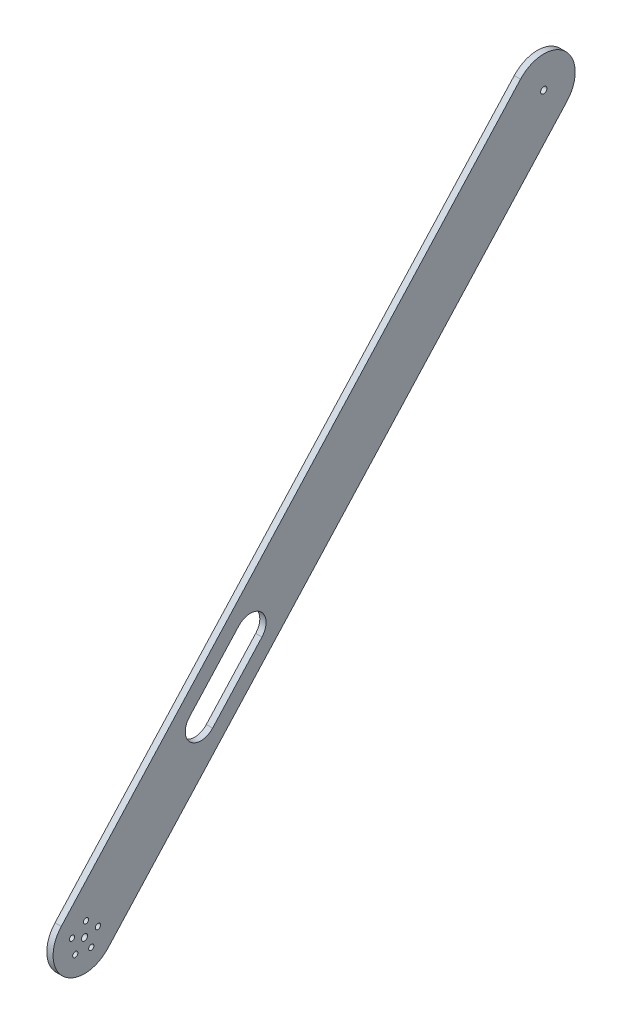
ISO-10303-21;
HEADER;
FILE_DESCRIPTION(('STEP AP214'),'2;1');
FILE_NAME('part.step','',(''),(''),'','','');
FILE_SCHEMA(('AUTOMOTIVE_DESIGN { 1 0 10303 214 1 1 1 1 }'));
ENDSEC;
DATA;
#1=APPLICATION_CONTEXT('core data for automotive mechanical design processes');
#2=APPLICATION_PROTOCOL_DEFINITION('international standard','automotive_design',2000,#1);
#3=PRODUCT_CONTEXT('',#1,'mechanical');
#4=PRODUCT('Part','Part','',(#3));
#5=PRODUCT_RELATED_PRODUCT_CATEGORY('part','',(#4));
#6=PRODUCT_DEFINITION_FORMATION('','',#4);
#7=PRODUCT_DEFINITION_CONTEXT('part definition',#1,'design');
#8=PRODUCT_DEFINITION('design','',#6,#7);
#9=PRODUCT_DEFINITION_SHAPE('','',#8);
#10=(LENGTH_UNIT() NAMED_UNIT(*) SI_UNIT(.MILLI.,.METRE.));
#11=(NAMED_UNIT(*) PLANE_ANGLE_UNIT() SI_UNIT($,.RADIAN.));
#12=(NAMED_UNIT(*) SI_UNIT($,.STERADIAN.) SOLID_ANGLE_UNIT());
#13=UNCERTAINTY_MEASURE_WITH_UNIT(LENGTH_MEASURE(1.E-05),#10,'distance_accuracy_value','');
#14=(GEOMETRIC_REPRESENTATION_CONTEXT(3) GLOBAL_UNCERTAINTY_ASSIGNED_CONTEXT((#13)) GLOBAL_UNIT_ASSIGNED_CONTEXT((#10,
#11,#12)) REPRESENTATION_CONTEXT('',''));
#15=CARTESIAN_POINT('',(0.,0.,0.));
#16=DIRECTION('',(0.,0.,1.));
#17=DIRECTION('',(1.,0.,0.));
#18=AXIS2_PLACEMENT_3D('',#15,#16,#17);
#19=CARTESIAN_POINT('',(3.00000000000006,18.25,459.758526992903));
#20=DIRECTION('',(-1.,0.,0.));
#21=DIRECTION('',(0.,0.,1.));
#22=AXIS2_PLACEMENT_3D('',#19,#20,#21);
#23=CYLINDRICAL_SURFACE('',#22,14.9999999999999);
#24=CARTESIAN_POINT('',(0.,18.25,459.758526992903));
#25=DIRECTION('',(-1.,0.,0.));
#26=DIRECTION('',(0.,0.,1.));
#27=AXIS2_PLACEMENT_3D('',#24,#25,#26);
#28=CIRCLE('',#27,14.9999999999999);
#29=CARTESIAN_POINT('',(0.,8.14846685124695,448.669837798745));
#30=VERTEX_POINT('',#29);
#31=CARTESIAN_POINT('',(0.,28.3515331487531,470.847216187061));
#32=VERTEX_POINT('',#31);
#33=EDGE_CURVE('E135',#30,#32,#28,.T.);
#34=ORIENTED_EDGE('',*,*,#33,.F.);
#35=DIRECTION('',(-1.,0.,0.));
#36=VECTOR('',#35,1.);
#37=CARTESIAN_POINT('',(3.00000000000006,8.14846685124695,448.669837798745));
#38=LINE('',#37,#36);
#39=CARTESIAN_POINT('',(3.00000000000006,8.14846685124695,448.669837798745));
#40=VERTEX_POINT('',#39);
#41=EDGE_CURVE('E11',#40,#30,#38,.T.);
#42=ORIENTED_EDGE('',*,*,#41,.F.);
#43=CARTESIAN_POINT('',(3.00000000000006,18.25,459.758526992903));
#44=DIRECTION('',(-1.,0.,0.));
#45=DIRECTION('',(0.,0.,1.));
#46=AXIS2_PLACEMENT_3D('',#43,#44,#45);
#47=CIRCLE('',#46,14.9999999999999);
#48=CARTESIAN_POINT('',(3.00000000000006,28.3515331487531,470.847216187061));
#49=VERTEX_POINT('',#48);
#50=EDGE_CURVE('E139',#40,#49,#47,.T.);
#51=ORIENTED_EDGE('',*,*,#50,.T.);
#52=DIRECTION('',(-1.,0.,0.));
#53=VECTOR('',#52,1.);
#54=CARTESIAN_POINT('',(3.00000000000006,28.3515331487531,470.847216187061));
#55=LINE('',#54,#53);
#56=EDGE_CURVE('E36',#49,#32,#55,.T.);
#57=ORIENTED_EDGE('',*,*,#56,.T.);
#58=EDGE_LOOP('',(#34,#42,#51,#57));
#59=FACE_BOUND('',#58,.T.);
#60=ADVANCED_FACE('F33',(#59),#23,.T.);
#61=CARTESIAN_POINT('',(3.00000000000006,8.14846685124695,448.669837798745));
#62=DIRECTION('',(0.,-0.673435543250208,-0.739245946277217));
#63=DIRECTION('',(0.,0.739245946277217,-0.673435543250208));
#64=AXIS2_PLACEMENT_3D('',#61,#62,#63);
#65=PLANE('',#64);
#66=DIRECTION('',(0.,-0.739245946277217,0.673435543250208));
#67=VECTOR('',#66,1.);
#68=CARTESIAN_POINT('',(0.,8.14846685124695,448.669837798745));
#69=LINE('',#68,#67);
#70=CARTESIAN_POINT('',(0.,248.67816899835,229.552977640134));
#71=VERTEX_POINT('',#70);
#72=EDGE_CURVE('E143',#71,#30,#69,.T.);
#73=ORIENTED_EDGE('',*,*,#72,.F.);
#74=DIRECTION('',(-1.,0.,0.));
#75=VECTOR('',#74,1.);
#76=CARTESIAN_POINT('',(3.00000000000003,248.67816899835,229.552977640134));
#77=LINE('',#76,#75);
#78=CARTESIAN_POINT('',(3.00000000000003,248.67816899835,229.552977640134));
#79=VERTEX_POINT('',#78);
#80=EDGE_CURVE('E41',#79,#71,#77,.T.);
#81=ORIENTED_EDGE('',*,*,#80,.F.);
#82=DIRECTION('',(0.,-0.739245946277217,0.673435543250208));
#83=VECTOR('',#82,1.);
#84=CARTESIAN_POINT('',(3.00000000000006,8.14846685124695,448.669837798745));
#85=LINE('',#84,#83);
#86=EDGE_CURVE('E149',#79,#40,#85,.T.);
#87=ORIENTED_EDGE('',*,*,#86,.T.);
#88=ORIENTED_EDGE('',*,*,#41,.T.);
#89=EDGE_LOOP('',(#73,#81,#87,#88));
#90=FACE_BOUND('',#89,.T.);
#91=ADVANCED_FACE('F175',(#90),#65,.T.);
#92=CARTESIAN_POINT('',(3.00000000000003,258.779702147103,240.641666834292));
#93=DIRECTION('',(-1.,0.,0.));
#94=DIRECTION('',(0.,0.,1.));
#95=AXIS2_PLACEMENT_3D('',#92,#93,#94);
#96=CYLINDRICAL_SURFACE('',#95,14.9999999999999);
#97=CARTESIAN_POINT('',(0.,258.779702147103,240.641666834292));
#98=DIRECTION('',(-1.,0.,0.));
#99=DIRECTION('',(0.,0.,1.));
#100=AXIS2_PLACEMENT_3D('',#97,#98,#99);
#101=CIRCLE('',#100,14.9999999999999);
#102=CARTESIAN_POINT('',(0.,268.881235295856,251.73035602845));
#103=VERTEX_POINT('',#102);
#104=EDGE_CURVE('E157',#103,#71,#101,.T.);
#105=ORIENTED_EDGE('',*,*,#104,.F.);
#106=DIRECTION('',(-1.,0.,0.));
#107=VECTOR('',#106,1.);
#108=CARTESIAN_POINT('',(3.00000000000003,268.881235295856,251.73035602845));
#109=LINE('',#108,#107);
#110=CARTESIAN_POINT('',(3.00000000000003,268.881235295856,251.73035602845));
#111=VERTEX_POINT('',#110);
#112=EDGE_CURVE('E162',#111,#103,#109,.T.);
#113=ORIENTED_EDGE('',*,*,#112,.F.);
#114=CARTESIAN_POINT('',(3.00000000000003,258.779702147103,240.641666834292));
#115=DIRECTION('',(-1.,0.,0.));
#116=DIRECTION('',(0.,0.,1.));
#117=AXIS2_PLACEMENT_3D('',#114,#115,#116);
#118=CIRCLE('',#117,14.9999999999999);
#119=EDGE_CURVE('E146',#111,#79,#118,.T.);
#120=ORIENTED_EDGE('',*,*,#119,.T.);
#121=ORIENTED_EDGE('',*,*,#80,.T.);
#122=EDGE_LOOP('',(#105,#113,#120,#121));
#123=FACE_BOUND('',#122,.T.);
#124=ADVANCED_FACE('F179',(#123),#96,.T.);
#125=CARTESIAN_POINT('',(3.00000000000006,28.3515331487531,470.847216187061));
#126=DIRECTION('',(0.,0.673435543250208,0.739245946277216));
#127=DIRECTION('',(0.,-0.739245946277216,0.673435543250208));
#128=AXIS2_PLACEMENT_3D('',#125,#126,#127);
#129=PLANE('',#128);
#130=DIRECTION('',(0.,0.739245946277216,-0.673435543250208));
#131=VECTOR('',#130,1.);
#132=CARTESIAN_POINT('',(0.,28.3515331487531,470.847216187061));
#133=LINE('',#132,#131);
#134=EDGE_CURVE('E154',#32,#103,#133,.T.);
#135=ORIENTED_EDGE('',*,*,#134,.F.);
#136=ORIENTED_EDGE('',*,*,#56,.F.);
#137=DIRECTION('',(0.,0.739245946277216,-0.673435543250208));
#138=VECTOR('',#137,1.);
#139=CARTESIAN_POINT('',(3.00000000000006,28.3515331487531,470.847216187061));
#140=LINE('',#139,#138);
#141=EDGE_CURVE('E142',#49,#111,#140,.T.);
#142=ORIENTED_EDGE('',*,*,#141,.T.);
#143=ORIENTED_EDGE('',*,*,#112,.T.);
#144=EDGE_LOOP('',(#135,#136,#142,#143));
#145=FACE_BOUND('',#144,.T.);
#146=ADVANCED_FACE('F170',(#145),#129,.T.);
#147=CARTESIAN_POINT('',(3.00000000000006,18.25,459.758526992903));
#148=DIRECTION('',(-1.,0.,0.));
#149=DIRECTION('',(0.,0.,1.));
#150=AXIS2_PLACEMENT_3D('',#147,#148,#149);
#151=PLANE('',#150);
#152=CARTESIAN_POINT('',(3.00000000000006,24.7600319933578,459.036042774766));
#153=DIRECTION('',(-1.,0.,0.));
#154=DIRECTION('',(0.,0.,1.));
#155=AXIS2_PLACEMENT_3D('',#152,#153,#154);
#156=CIRCLE('',#155,1.25000000000094);
#157=CARTESIAN_POINT('',(3.00000000000006,24.7600319933578,460.286042774766));
#158=VERTEX_POINT('',#157);
#159=EDGE_CURVE('E334',#158,#158,#156,.T.);
#160=ORIENTED_EDGE('',*,*,#159,.T.);
#161=EDGE_LOOP('',(#160));
#162=FACE_BOUND('',#161,.T.);
#163=CARTESIAN_POINT('',(3.00000000000006,19.574587196292,453.343858742758));
#164=DIRECTION('',(-1.,0.,0.));
#165=DIRECTION('',(0.,0.,1.));
#166=AXIS2_PLACEMENT_3D('',#163,#164,#165);
#167=CIRCLE('',#166,1.24999999999982);
#168=CARTESIAN_POINT('',(3.00000000000006,19.574587196292,454.593858742758));
#169=VERTEX_POINT('',#168);
#170=EDGE_CURVE('E342',#169,#169,#167,.T.);
#171=ORIENTED_EDGE('',*,*,#170,.T.);
#172=EDGE_LOOP('',(#171));
#173=FACE_BOUND('',#172,.T.);
#174=CARTESIAN_POINT('',(3.00000000000006,20.9488338434524,465.726675439904));
#175=DIRECTION('',(-1.,0.,0.));
#176=DIRECTION('',(0.,0.,1.));
#177=AXIS2_PLACEMENT_3D('',#174,#175,#176);
#178=CIRCLE('',#177,1.24999999999996);
#179=CARTESIAN_POINT('',(3.00000000000006,20.9488338434524,466.976675439904));
#180=VERTEX_POINT('',#179);
#181=EDGE_CURVE('E348',#180,#180,#178,.T.);
#182=ORIENTED_EDGE('',*,*,#181,.T.);
#183=EDGE_LOOP('',(#182));
#184=FACE_BOUND('',#183,.T.);
#185=CARTESIAN_POINT('',(3.00000000000006,13.4079390518843,464.169529801192));
#186=DIRECTION('',(-1.,0.,0.));
#187=DIRECTION('',(0.,0.,1.));
#188=AXIS2_PLACEMENT_3D('',#185,#186,#187);
#189=CIRCLE('',#188,1.24999999999996);
#190=CARTESIAN_POINT('',(3.00000000000006,13.4079390518843,465.419529801192));
#191=VERTEX_POINT('',#190);
#192=EDGE_CURVE('E354',#191,#191,#189,.T.);
#193=ORIENTED_EDGE('',*,*,#192,.T.);
#194=EDGE_LOOP('',(#193));
#195=FACE_BOUND('',#194,.T.);
#196=CARTESIAN_POINT('',(3.00000000000006,12.5586079150136,456.516528205896));
#197=DIRECTION('',(-1.,0.,0.));
#198=DIRECTION('',(0.,0.,1.));
#199=AXIS2_PLACEMENT_3D('',#196,#197,#198);
#200=CIRCLE('',#199,1.24999999999996);
#201=CARTESIAN_POINT('',(3.00000000000006,12.5586079150136,457.766528205896));
#202=VERTEX_POINT('',#201);
#203=EDGE_CURVE('E360',#202,#202,#200,.T.);
#204=ORIENTED_EDGE('',*,*,#203,.T.);
#205=EDGE_LOOP('',(#204));
#206=FACE_BOUND('',#205,.T.);
#207=CARTESIAN_POINT('',(3.00000000000006,18.25,459.758526992903));
#208=DIRECTION('',(-1.,0.,0.));
#209=DIRECTION('',(0.,0.,1.));
#210=AXIS2_PLACEMENT_3D('',#207,#208,#209);
#211=CIRCLE('',#210,1.50000000000002);
#212=CARTESIAN_POINT('',(3.00000000000006,18.25,461.258526992903));
#213=VERTEX_POINT('',#212);
#214=EDGE_CURVE('E366',#213,#213,#211,.T.);
#215=ORIENTED_EDGE('',*,*,#214,.T.);
#216=EDGE_LOOP('',(#215));
#217=FACE_BOUND('',#216,.T.);
#218=CARTESIAN_POINT('',(3.00000000000003,258.779702147103,240.641666834292));
#219=DIRECTION('',(-1.,0.,0.));
#220=DIRECTION('',(0.,0.,1.));
#221=AXIS2_PLACEMENT_3D('',#218,#219,#220);
#222=CIRCLE('',#221,1.5);
#223=CARTESIAN_POINT('',(3.00000000000003,258.779702147103,242.141666834292));
#224=VERTEX_POINT('',#223);
#225=EDGE_CURVE('E129',#224,#224,#222,.T.);
#226=ORIENTED_EDGE('',*,*,#225,.T.);
#227=EDGE_LOOP('',(#226));
#228=FACE_BOUND('',#227,.T.);
#229=DIRECTION('',(0.,0.739245946277218,-0.673435543250207));
#230=VECTOR('',#229,1.);
#231=CARTESIAN_POINT('',(3.00000000000005,110.162165261945,386.174195258086));
#232=LINE('',#231,#230);
#233=CARTESIAN_POINT('',(3.00000000000005,84.2885571422414,409.744439271843));
#234=VERTEX_POINT('',#233);
#235=CARTESIAN_POINT('',(3.00000000000005,110.162165261945,386.174195258086));
#236=VERTEX_POINT('',#235);
#237=EDGE_CURVE('E106',#234,#236,#232,.T.);
#238=ORIENTED_EDGE('',*,*,#237,.T.);
#239=CARTESIAN_POINT('',(3.00000000000005,105.111398687569,380.629850661008));
#240=DIRECTION('',(-1.,0.,0.));
#241=DIRECTION('',(0.,0.,1.));
#242=AXIS2_PLACEMENT_3D('',#239,#240,#241);
#243=CIRCLE('',#242,7.49999999999866);
#244=CARTESIAN_POINT('',(3.00000000000005,100.060632113193,375.085506063929));
#245=VERTEX_POINT('',#244);
#246=EDGE_CURVE('E100',#236,#245,#243,.T.);
#247=ORIENTED_EDGE('',*,*,#246,.T.);
#248=DIRECTION('',(0.,-0.739245946277216,0.673435543250209));
#249=VECTOR('',#248,1.);
#250=CARTESIAN_POINT('',(3.00000000000005,100.060632113193,375.085506063929));
#251=LINE('',#250,#249);
#252=CARTESIAN_POINT('',(3.00000000000005,74.1870239934901,398.655750077687));
#253=VERTEX_POINT('',#252);
#254=EDGE_CURVE('E109',#245,#253,#251,.T.);
#255=ORIENTED_EDGE('',*,*,#254,.T.);
#256=CARTESIAN_POINT('',(3.00000000000005,79.2377905678657,404.200094674765));
#257=DIRECTION('',(-1.,0.,0.));
#258=DIRECTION('',(0.,0.,1.));
#259=AXIS2_PLACEMENT_3D('',#256,#257,#258);
#260=CIRCLE('',#259,7.4999999999986);
#261=EDGE_CURVE('E49',#253,#234,#260,.T.);
#262=ORIENTED_EDGE('',*,*,#261,.T.);
#263=EDGE_LOOP('',(#238,#247,#255,#262));
#264=FACE_BOUND('',#263,.T.);
#265=ORIENTED_EDGE('',*,*,#50,.F.);
#266=ORIENTED_EDGE('',*,*,#86,.F.);
#267=ORIENTED_EDGE('',*,*,#119,.F.);
#268=ORIENTED_EDGE('',*,*,#141,.F.);
#269=EDGE_LOOP('',(#265,#266,#267,#268));
#270=FACE_BOUND('',#269,.T.);
#271=ADVANCED_FACE('F113',(#162,#173,#184,#195,#206,#217,#228,#264,#270),#151,.F.);
#272=CARTESIAN_POINT('',(0.,18.25,459.758526992903));
#273=DIRECTION('',(-1.,0.,0.));
#274=DIRECTION('',(0.,0.,1.));
#275=AXIS2_PLACEMENT_3D('',#272,#273,#274);
#276=PLANE('',#275);
#277=CARTESIAN_POINT('',(0.,24.7600319933578,459.036042774766));
#278=DIRECTION('',(-1.,0.,0.));
#279=DIRECTION('',(0.,0.,1.));
#280=AXIS2_PLACEMENT_3D('',#277,#278,#279);
#281=CIRCLE('',#280,1.25000000000094);
#282=CARTESIAN_POINT('',(0.,24.7600319933578,460.286042774766));
#283=VERTEX_POINT('',#282);
#284=EDGE_CURVE('E337',#283,#283,#281,.T.);
#285=ORIENTED_EDGE('',*,*,#284,.F.);
#286=EDGE_LOOP('',(#285));
#287=FACE_BOUND('',#286,.T.);
#288=CARTESIAN_POINT('',(0.,19.574587196292,453.343858742758));
#289=DIRECTION('',(-1.,0.,0.));
#290=DIRECTION('',(0.,0.,1.));
#291=AXIS2_PLACEMENT_3D('',#288,#289,#290);
#292=CIRCLE('',#291,1.24999999999982);
#293=CARTESIAN_POINT('',(0.,19.574587196292,454.593858742758));
#294=VERTEX_POINT('',#293);
#295=EDGE_CURVE('E339',#294,#294,#292,.T.);
#296=ORIENTED_EDGE('',*,*,#295,.F.);
#297=EDGE_LOOP('',(#296));
#298=FACE_BOUND('',#297,.T.);
#299=CARTESIAN_POINT('',(0.,20.9488338434524,465.726675439904));
#300=DIRECTION('',(-1.,0.,0.));
#301=DIRECTION('',(0.,0.,1.));
#302=AXIS2_PLACEMENT_3D('',#299,#300,#301);
#303=CIRCLE('',#302,1.24999999999996);
#304=CARTESIAN_POINT('',(0.,20.9488338434524,466.976675439904));
#305=VERTEX_POINT('',#304);
#306=EDGE_CURVE('E345',#305,#305,#303,.T.);
#307=ORIENTED_EDGE('',*,*,#306,.F.);
#308=EDGE_LOOP('',(#307));
#309=FACE_BOUND('',#308,.T.);
#310=CARTESIAN_POINT('',(0.,13.4079390518843,464.169529801192));
#311=DIRECTION('',(-1.,0.,0.));
#312=DIRECTION('',(0.,0.,1.));
#313=AXIS2_PLACEMENT_3D('',#310,#311,#312);
#314=CIRCLE('',#313,1.24999999999996);
#315=CARTESIAN_POINT('',(0.,13.4079390518843,465.419529801192));
#316=VERTEX_POINT('',#315);
#317=EDGE_CURVE('E351',#316,#316,#314,.T.);
#318=ORIENTED_EDGE('',*,*,#317,.F.);
#319=EDGE_LOOP('',(#318));
#320=FACE_BOUND('',#319,.T.);
#321=CARTESIAN_POINT('',(0.,12.5586079150136,456.516528205896));
#322=DIRECTION('',(-1.,0.,0.));
#323=DIRECTION('',(0.,0.,1.));
#324=AXIS2_PLACEMENT_3D('',#321,#322,#323);
#325=CIRCLE('',#324,1.24999999999996);
#326=CARTESIAN_POINT('',(0.,12.5586079150136,457.766528205896));
#327=VERTEX_POINT('',#326);
#328=EDGE_CURVE('E357',#327,#327,#325,.T.);
#329=ORIENTED_EDGE('',*,*,#328,.F.);
#330=EDGE_LOOP('',(#329));
#331=FACE_BOUND('',#330,.T.);
#332=CARTESIAN_POINT('',(0.,18.25,459.758526992903));
#333=DIRECTION('',(-1.,0.,0.));
#334=DIRECTION('',(0.,0.,1.));
#335=AXIS2_PLACEMENT_3D('',#332,#333,#334);
#336=CIRCLE('',#335,1.50000000000002);
#337=CARTESIAN_POINT('',(0.,18.25,461.258526992903));
#338=VERTEX_POINT('',#337);
#339=EDGE_CURVE('E363',#338,#338,#336,.T.);
#340=ORIENTED_EDGE('',*,*,#339,.F.);
#341=EDGE_LOOP('',(#340));
#342=FACE_BOUND('',#341,.T.);
#343=CARTESIAN_POINT('',(0.,258.779702147103,240.641666834292));
#344=DIRECTION('',(-1.,0.,0.));
#345=DIRECTION('',(0.,0.,1.));
#346=AXIS2_PLACEMENT_3D('',#343,#344,#345);
#347=CIRCLE('',#346,1.5);
#348=CARTESIAN_POINT('',(0.,258.779702147103,242.141666834292));
#349=VERTEX_POINT('',#348);
#350=EDGE_CURVE('E122',#349,#349,#347,.T.);
#351=ORIENTED_EDGE('',*,*,#350,.F.);
#352=EDGE_LOOP('',(#351));
#353=FACE_BOUND('',#352,.T.);
#354=CARTESIAN_POINT('',(0.,105.111398687569,380.629850661008));
#355=DIRECTION('',(-1.,0.,0.));
#356=DIRECTION('',(0.,0.,1.));
#357=AXIS2_PLACEMENT_3D('',#354,#355,#356);
#358=CIRCLE('',#357,7.49999999999866);
#359=CARTESIAN_POINT('',(0.,110.162165261945,386.174195258086));
#360=VERTEX_POINT('',#359);
#361=CARTESIAN_POINT('',(0.,100.060632113193,375.085506063929));
#362=VERTEX_POINT('',#361);
#363=EDGE_CURVE('E57',#360,#362,#358,.T.);
#364=ORIENTED_EDGE('',*,*,#363,.F.);
#365=DIRECTION('',(0.,0.739245946277218,-0.673435543250207));
#366=VECTOR('',#365,1.);
#367=CARTESIAN_POINT('',(0.,110.162165261945,386.174195258086));
#368=LINE('',#367,#366);
#369=CARTESIAN_POINT('',(0.,84.2885571422414,409.744439271843));
#370=VERTEX_POINT('',#369);
#371=EDGE_CURVE('E116',#370,#360,#368,.T.);
#372=ORIENTED_EDGE('',*,*,#371,.F.);
#373=CARTESIAN_POINT('',(0.,79.2377905678657,404.200094674765));
#374=DIRECTION('',(-1.,0.,0.));
#375=DIRECTION('',(0.,0.,1.));
#376=AXIS2_PLACEMENT_3D('',#373,#374,#375);
#377=CIRCLE('',#376,7.4999999999986);
#378=CARTESIAN_POINT('',(0.,74.1870239934901,398.655750077687));
#379=VERTEX_POINT('',#378);
#380=EDGE_CURVE('E119',#379,#370,#377,.T.);
#381=ORIENTED_EDGE('',*,*,#380,.F.);
#382=DIRECTION('',(0.,-0.739245946277216,0.673435543250209));
#383=VECTOR('',#382,1.);
#384=CARTESIAN_POINT('',(0.,100.060632113193,375.085506063929));
#385=LINE('',#384,#383);
#386=EDGE_CURVE('E128',#362,#379,#385,.T.);
#387=ORIENTED_EDGE('',*,*,#386,.F.);
#388=EDGE_LOOP('',(#364,#372,#381,#387));
#389=FACE_BOUND('',#388,.T.);
#390=ORIENTED_EDGE('',*,*,#33,.T.);
#391=ORIENTED_EDGE('',*,*,#134,.T.);
#392=ORIENTED_EDGE('',*,*,#104,.T.);
#393=ORIENTED_EDGE('',*,*,#72,.T.);
#394=EDGE_LOOP('',(#390,#391,#392,#393));
#395=FACE_BOUND('',#394,.T.);
#396=ADVANCED_FACE('F172',(#287,#298,#309,#320,#331,#342,#353,#389,#395),#276,.T.);
#397=CARTESIAN_POINT('',(3.00000000000005,105.111398687569,380.629850661008));
#398=DIRECTION('',(-1.,0.,0.));
#399=DIRECTION('',(0.,0.,1.));
#400=AXIS2_PLACEMENT_3D('',#397,#398,#399);
#401=CYLINDRICAL_SURFACE('',#400,7.49999999999866);
#402=ORIENTED_EDGE('',*,*,#363,.T.);
#403=DIRECTION('',(-1.,0.,0.));
#404=VECTOR('',#403,1.);
#405=CARTESIAN_POINT('',(3.00000000000005,100.060632113193,375.085506063929));
#406=LINE('',#405,#404);
#407=EDGE_CURVE('E96',#245,#362,#406,.T.);
#408=ORIENTED_EDGE('',*,*,#407,.F.);
#409=ORIENTED_EDGE('',*,*,#246,.F.);
#410=DIRECTION('',(-1.,0.,0.));
#411=VECTOR('',#410,1.);
#412=CARTESIAN_POINT('',(3.00000000000005,110.162165261945,386.174195258086));
#413=LINE('',#412,#411);
#414=EDGE_CURVE('E133',#236,#360,#413,.T.);
#415=ORIENTED_EDGE('',*,*,#414,.T.);
#416=EDGE_LOOP('',(#402,#408,#409,#415));
#417=FACE_BOUND('',#416,.T.);
#418=ADVANCED_FACE('F98',(#417),#401,.F.);
#419=CARTESIAN_POINT('',(3.00000000000005,110.162165261945,386.174195258086));
#420=DIRECTION('',(0.,0.673435543250206,0.739245946277218));
#421=DIRECTION('',(0.,-0.739245946277218,0.673435543250206));
#422=AXIS2_PLACEMENT_3D('',#419,#420,#421);
#423=PLANE('',#422);
#424=ORIENTED_EDGE('',*,*,#371,.T.);
#425=ORIENTED_EDGE('',*,*,#414,.F.);
#426=ORIENTED_EDGE('',*,*,#237,.F.);
#427=DIRECTION('',(-1.,0.,0.));
#428=VECTOR('',#427,1.);
#429=CARTESIAN_POINT('',(3.00000000000005,84.2885571422414,409.744439271843));
#430=LINE('',#429,#428);
#431=EDGE_CURVE('E136',#234,#370,#430,.T.);
#432=ORIENTED_EDGE('',*,*,#431,.T.);
#433=EDGE_LOOP('',(#424,#425,#426,#432));
#434=FACE_BOUND('',#433,.T.);
#435=ADVANCED_FACE('F231',(#434),#423,.F.);
#436=CARTESIAN_POINT('',(3.00000000000005,79.2377905678657,404.200094674765));
#437=DIRECTION('',(-1.,0.,0.));
#438=DIRECTION('',(0.,0.,1.));
#439=AXIS2_PLACEMENT_3D('',#436,#437,#438);
#440=CYLINDRICAL_SURFACE('',#439,7.4999999999986);
#441=ORIENTED_EDGE('',*,*,#380,.T.);
#442=ORIENTED_EDGE('',*,*,#431,.F.);
#443=ORIENTED_EDGE('',*,*,#261,.F.);
#444=DIRECTION('',(-1.,0.,0.));
#445=VECTOR('',#444,1.);
#446=CARTESIAN_POINT('',(3.00000000000005,74.1870239934901,398.655750077687));
#447=LINE('',#446,#445);
#448=EDGE_CURVE('E105',#253,#379,#447,.T.);
#449=ORIENTED_EDGE('',*,*,#448,.T.);
#450=EDGE_LOOP('',(#441,#442,#443,#449));
#451=FACE_BOUND('',#450,.T.);
#452=ADVANCED_FACE('F240',(#451),#440,.F.);
#453=CARTESIAN_POINT('',(3.00000000000005,100.060632113193,375.085506063929));
#454=DIRECTION('',(0.,-0.673435543250209,-0.739245946277216));
#455=DIRECTION('',(0.,0.739245946277216,-0.673435543250209));
#456=AXIS2_PLACEMENT_3D('',#453,#454,#455);
#457=PLANE('',#456);
#458=ORIENTED_EDGE('',*,*,#386,.T.);
#459=ORIENTED_EDGE('',*,*,#448,.F.);
#460=ORIENTED_EDGE('',*,*,#254,.F.);
#461=ORIENTED_EDGE('',*,*,#407,.T.);
#462=EDGE_LOOP('',(#458,#459,#460,#461));
#463=FACE_BOUND('',#462,.T.);
#464=ADVANCED_FACE('F110',(#463),#457,.F.);
#465=CARTESIAN_POINT('',(3.00000000000003,258.779702147103,240.641666834292));
#466=DIRECTION('',(-1.,0.,0.));
#467=DIRECTION('',(0.,0.,1.));
#468=AXIS2_PLACEMENT_3D('',#465,#466,#467);
#469=CYLINDRICAL_SURFACE('',#468,1.5);
#470=ORIENTED_EDGE('',*,*,#225,.F.);
#471=EDGE_LOOP('',(#470));
#472=FACE_BOUND('',#471,.T.);
#473=ORIENTED_EDGE('',*,*,#350,.T.);
#474=EDGE_LOOP('',(#473));
#475=FACE_BOUND('',#474,.T.);
#476=ADVANCED_FACE('F258',(#472,#475),#469,.F.);
#477=CARTESIAN_POINT('',(3.00000000000006,18.25,459.758526992903));
#478=DIRECTION('',(-1.,0.,0.));
#479=DIRECTION('',(0.,0.,1.));
#480=AXIS2_PLACEMENT_3D('',#477,#478,#479);
#481=CYLINDRICAL_SURFACE('',#480,1.50000000000002);
#482=ORIENTED_EDGE('',*,*,#214,.F.);
#483=EDGE_LOOP('',(#482));
#484=FACE_BOUND('',#483,.T.);
#485=ORIENTED_EDGE('',*,*,#339,.T.);
#486=EDGE_LOOP('',(#485));
#487=FACE_BOUND('',#486,.T.);
#488=ADVANCED_FACE('F267',(#484,#487),#481,.F.);
#489=CARTESIAN_POINT('',(3.00000000000006,12.5586079150136,456.516528205896));
#490=DIRECTION('',(-1.,0.,0.));
#491=DIRECTION('',(0.,0.,1.));
#492=AXIS2_PLACEMENT_3D('',#489,#490,#491);
#493=CYLINDRICAL_SURFACE('',#492,1.24999999999996);
#494=ORIENTED_EDGE('',*,*,#203,.F.);
#495=EDGE_LOOP('',(#494));
#496=FACE_BOUND('',#495,.T.);
#497=ORIENTED_EDGE('',*,*,#328,.T.);
#498=EDGE_LOOP('',(#497));
#499=FACE_BOUND('',#498,.T.);
#500=ADVANCED_FACE('F277',(#496,#499),#493,.F.);
#501=CARTESIAN_POINT('',(3.00000000000006,13.4079390518843,464.169529801192));
#502=DIRECTION('',(-1.,0.,0.));
#503=DIRECTION('',(0.,0.,1.));
#504=AXIS2_PLACEMENT_3D('',#501,#502,#503);
#505=CYLINDRICAL_SURFACE('',#504,1.24999999999996);
#506=ORIENTED_EDGE('',*,*,#192,.F.);
#507=EDGE_LOOP('',(#506));
#508=FACE_BOUND('',#507,.T.);
#509=ORIENTED_EDGE('',*,*,#317,.T.);
#510=EDGE_LOOP('',(#509));
#511=FACE_BOUND('',#510,.T.);
#512=ADVANCED_FACE('F287',(#508,#511),#505,.F.);
#513=CARTESIAN_POINT('',(3.00000000000006,20.9488338434524,465.726675439904));
#514=DIRECTION('',(-1.,0.,0.));
#515=DIRECTION('',(0.,0.,1.));
#516=AXIS2_PLACEMENT_3D('',#513,#514,#515);
#517=CYLINDRICAL_SURFACE('',#516,1.24999999999996);
#518=ORIENTED_EDGE('',*,*,#181,.F.);
#519=EDGE_LOOP('',(#518));
#520=FACE_BOUND('',#519,.T.);
#521=ORIENTED_EDGE('',*,*,#306,.T.);
#522=EDGE_LOOP('',(#521));
#523=FACE_BOUND('',#522,.T.);
#524=ADVANCED_FACE('F297',(#520,#523),#517,.F.);
#525=CARTESIAN_POINT('',(3.00000000000006,19.574587196292,453.343858742758));
#526=DIRECTION('',(-1.,0.,0.));
#527=DIRECTION('',(0.,0.,1.));
#528=AXIS2_PLACEMENT_3D('',#525,#526,#527);
#529=CYLINDRICAL_SURFACE('',#528,1.24999999999982);
#530=ORIENTED_EDGE('',*,*,#170,.F.);
#531=EDGE_LOOP('',(#530));
#532=FACE_BOUND('',#531,.T.);
#533=ORIENTED_EDGE('',*,*,#295,.T.);
#534=EDGE_LOOP('',(#533));
#535=FACE_BOUND('',#534,.T.);
#536=ADVANCED_FACE('F307',(#532,#535),#529,.F.);
#537=CARTESIAN_POINT('',(3.00000000000006,24.7600319933578,459.036042774766));
#538=DIRECTION('',(-1.,0.,0.));
#539=DIRECTION('',(0.,0.,1.));
#540=AXIS2_PLACEMENT_3D('',#537,#538,#539);
#541=CYLINDRICAL_SURFACE('',#540,1.25000000000094);
#542=ORIENTED_EDGE('',*,*,#159,.F.);
#543=EDGE_LOOP('',(#542));
#544=FACE_BOUND('',#543,.T.);
#545=ORIENTED_EDGE('',*,*,#284,.T.);
#546=EDGE_LOOP('',(#545));
#547=FACE_BOUND('',#546,.T.);
#548=ADVANCED_FACE('F317',(#544,#547),#541,.F.);
#549=CLOSED_SHELL('',(#60,#91,#124,#146,#271,#396,#418,#435,#452,#464,#476,#488,#500,#512,#524,
#536,#548));
#550=MANIFOLD_SOLID_BREP('B2',#549);
#551=ADVANCED_BREP_SHAPE_REPRESENTATION('',(#18,#550),#14);
#552=SHAPE_DEFINITION_REPRESENTATION(#9,#551);
ENDSEC;
END-ISO-10303-21;
